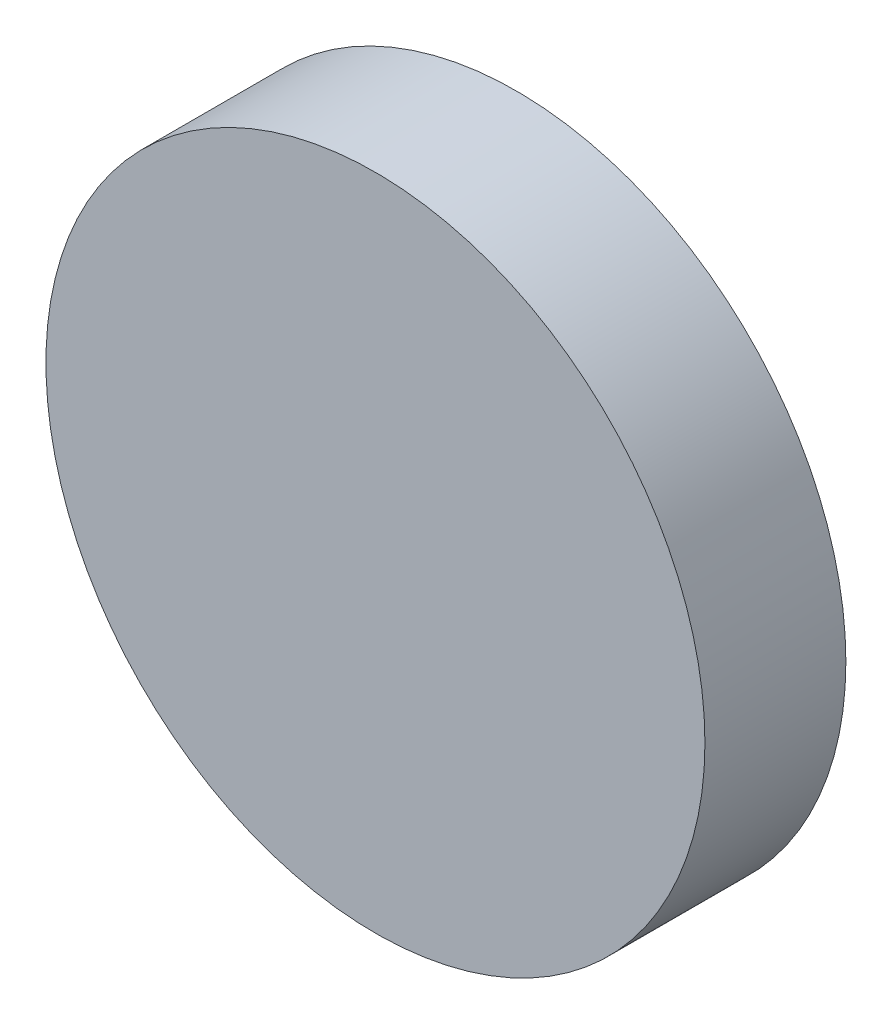
ISO-10303-21;
HEADER;
FILE_DESCRIPTION(('STEP AP214'),'2;1');
FILE_NAME('part.step','',(''),(''),'','','');
FILE_SCHEMA(('AUTOMOTIVE_DESIGN { 1 0 10303 214 1 1 1 1 }'));
ENDSEC;
DATA;
#1=APPLICATION_CONTEXT('core data for automotive mechanical design processes');
#2=APPLICATION_PROTOCOL_DEFINITION('international standard','automotive_design',2000,#1);
#3=PRODUCT_CONTEXT('',#1,'mechanical');
#4=PRODUCT('Part','Part','',(#3));
#5=PRODUCT_RELATED_PRODUCT_CATEGORY('part','',(#4));
#6=PRODUCT_DEFINITION_FORMATION('','',#4);
#7=PRODUCT_DEFINITION_CONTEXT('part definition',#1,'design');
#8=PRODUCT_DEFINITION('design','',#6,#7);
#9=PRODUCT_DEFINITION_SHAPE('','',#8);
#10=(LENGTH_UNIT() NAMED_UNIT(*) SI_UNIT(.MILLI.,.METRE.));
#11=(NAMED_UNIT(*) PLANE_ANGLE_UNIT() SI_UNIT($,.RADIAN.));
#12=(NAMED_UNIT(*) SI_UNIT($,.STERADIAN.) SOLID_ANGLE_UNIT());
#13=UNCERTAINTY_MEASURE_WITH_UNIT(LENGTH_MEASURE(1.E-05),#10,'distance_accuracy_value','');
#14=(GEOMETRIC_REPRESENTATION_CONTEXT(3) GLOBAL_UNCERTAINTY_ASSIGNED_CONTEXT((#13)) GLOBAL_UNIT_ASSIGNED_CONTEXT((#10,
#11,#12)) REPRESENTATION_CONTEXT('',''));
#15=CARTESIAN_POINT('',(0.,0.,0.));
#16=DIRECTION('',(0.,0.,1.));
#17=DIRECTION('',(1.,0.,0.));
#18=AXIS2_PLACEMENT_3D('',#15,#16,#17);
#19=CARTESIAN_POINT('',(-17.8186626216748,13.8200364413099,11.));
#20=DIRECTION('',(0.,0.,-1.));
#21=DIRECTION('',(-1.,0.,0.));
#22=AXIS2_PLACEMENT_3D('',#19,#20,#21);
#23=CYLINDRICAL_SURFACE('',#22,25.7158583902609);
#24=CARTESIAN_POINT('',(-17.8186626216748,13.8200364413099,11.));
#25=DIRECTION('',(0.,0.,1.));
#26=DIRECTION('',(1.,0.,0.));
#27=AXIS2_PLACEMENT_3D('',#24,#25,#26);
#28=CIRCLE('',#27,25.7158583902609);
#29=CARTESIAN_POINT('',(7.89719576858612,13.8200364413099,11.));
#30=VERTEX_POINT('',#29);
#31=EDGE_CURVE('E10',#30,#30,#28,.T.);
#32=ORIENTED_EDGE('',*,*,#31,.F.);
#33=EDGE_LOOP('',(#32));
#34=FACE_BOUND('',#33,.T.);
#35=CARTESIAN_POINT('',(-17.8186626216748,13.8200364413099,0.));
#36=DIRECTION('',(0.,0.,1.));
#37=DIRECTION('',(1.,0.,0.));
#38=AXIS2_PLACEMENT_3D('',#35,#36,#37);
#39=CIRCLE('',#38,25.7158583902609);
#40=CARTESIAN_POINT('',(7.89719576858612,13.8200364413099,0.));
#41=VERTEX_POINT('',#40);
#42=EDGE_CURVE('E40',#41,#41,#39,.T.);
#43=ORIENTED_EDGE('',*,*,#42,.T.);
#44=EDGE_LOOP('',(#43));
#45=FACE_BOUND('',#44,.T.);
#46=ADVANCED_FACE('F37',(#34,#45),#23,.T.);
#47=CARTESIAN_POINT('',(0.,0.,11.));
#48=DIRECTION('',(0.,0.,1.));
#49=DIRECTION('',(1.,0.,0.));
#50=AXIS2_PLACEMENT_3D('',#47,#48,#49);
#51=PLANE('',#50);
#52=ORIENTED_EDGE('',*,*,#31,.T.);
#53=EDGE_LOOP('',(#52));
#54=FACE_BOUND('',#53,.T.);
#55=ADVANCED_FACE('F52',(#54),#51,.T.);
#56=CARTESIAN_POINT('',(0.,0.,0.));
#57=DIRECTION('',(0.,0.,1.));
#58=DIRECTION('',(1.,0.,0.));
#59=AXIS2_PLACEMENT_3D('',#56,#57,#58);
#60=PLANE('',#59);
#61=ORIENTED_EDGE('',*,*,#42,.F.);
#62=EDGE_LOOP('',(#61));
#63=FACE_BOUND('',#62,.T.);
#64=ADVANCED_FACE('F50',(#63),#60,.F.);
#65=CLOSED_SHELL('',(#46,#55,#64));
#66=MANIFOLD_SOLID_BREP('B2',#65);
#67=ADVANCED_BREP_SHAPE_REPRESENTATION('',(#18,#66),#14);
#68=SHAPE_DEFINITION_REPRESENTATION(#9,#67);
ENDSEC;
END-ISO-10303-21;
